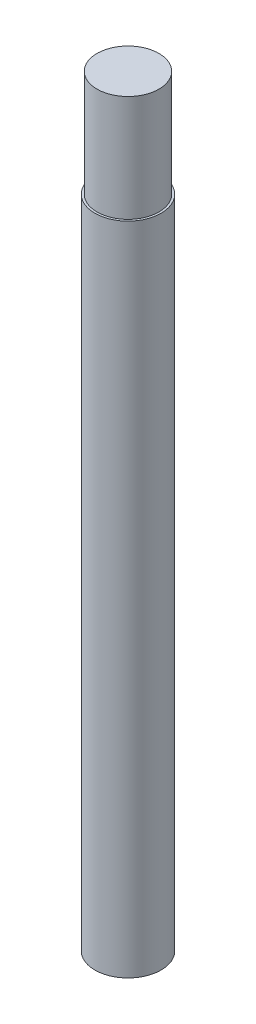
ISO-10303-21;
HEADER;
FILE_DESCRIPTION(('STEP AP214'),'2;1');
FILE_NAME('part.step','',(''),(''),'','','');
FILE_SCHEMA(('AUTOMOTIVE_DESIGN { 1 0 10303 214 1 1 1 1 }'));
ENDSEC;
DATA;
#1=APPLICATION_CONTEXT('core data for automotive mechanical design processes');
#2=APPLICATION_PROTOCOL_DEFINITION('international standard','automotive_design',2000,#1);
#3=PRODUCT_CONTEXT('',#1,'mechanical');
#4=PRODUCT('Part','Part','',(#3));
#5=PRODUCT_RELATED_PRODUCT_CATEGORY('part','',(#4));
#6=PRODUCT_DEFINITION_FORMATION('','',#4);
#7=PRODUCT_DEFINITION_CONTEXT('part definition',#1,'design');
#8=PRODUCT_DEFINITION('design','',#6,#7);
#9=PRODUCT_DEFINITION_SHAPE('','',#8);
#10=(LENGTH_UNIT() NAMED_UNIT(*) SI_UNIT(.MILLI.,.METRE.));
#11=(NAMED_UNIT(*) PLANE_ANGLE_UNIT() SI_UNIT($,.RADIAN.));
#12=(NAMED_UNIT(*) SI_UNIT($,.STERADIAN.) SOLID_ANGLE_UNIT());
#13=UNCERTAINTY_MEASURE_WITH_UNIT(LENGTH_MEASURE(1.E-05),#10,'distance_accuracy_value','');
#14=(GEOMETRIC_REPRESENTATION_CONTEXT(3) GLOBAL_UNCERTAINTY_ASSIGNED_CONTEXT((#13)) GLOBAL_UNIT_ASSIGNED_CONTEXT((#10,
#11,#12)) REPRESENTATION_CONTEXT('',''));
#15=CARTESIAN_POINT('',(0.,0.,0.));
#16=DIRECTION('',(0.,0.,1.));
#17=DIRECTION('',(1.,0.,0.));
#18=AXIS2_PLACEMENT_3D('',#15,#16,#17);
#19=CARTESIAN_POINT('',(0.,156.4386,0.));
#20=DIRECTION('',(0.,-1.,0.));
#21=DIRECTION('',(0.,0.,-1.));
#22=AXIS2_PLACEMENT_3D('',#19,#20,#21);
#23=CYLINDRICAL_SURFACE('',#22,7.89305);
#24=CARTESIAN_POINT('',(0.,156.4386,0.));
#25=DIRECTION('',(0.,1.,0.));
#26=DIRECTION('',(0.,0.,1.));
#27=AXIS2_PLACEMENT_3D('',#24,#25,#26);
#28=CIRCLE('',#27,7.89305);
#29=CARTESIAN_POINT('',(0.,156.4386,7.89305));
#30=VERTEX_POINT('',#29);
#31=EDGE_CURVE('E10',#30,#30,#28,.T.);
#32=ORIENTED_EDGE('',*,*,#31,.F.);
#33=EDGE_LOOP('',(#32));
#34=FACE_BOUND('',#33,.T.);
#35=CARTESIAN_POINT('',(0.,0.,0.));
#36=DIRECTION('',(0.,1.,0.));
#37=DIRECTION('',(0.,0.,1.));
#38=AXIS2_PLACEMENT_3D('',#35,#36,#37);
#39=CIRCLE('',#38,7.89305);
#40=CARTESIAN_POINT('',(0.,0.,7.89305));
#41=VERTEX_POINT('',#40);
#42=EDGE_CURVE('E44',#41,#41,#39,.T.);
#43=ORIENTED_EDGE('',*,*,#42,.T.);
#44=EDGE_LOOP('',(#43));
#45=FACE_BOUND('',#44,.T.);
#46=ADVANCED_FACE('F41',(#34,#45),#23,.T.);
#47=CARTESIAN_POINT('',(0.,156.4386,0.));
#48=DIRECTION('',(0.,1.,0.));
#49=DIRECTION('',(0.,0.,1.));
#50=AXIS2_PLACEMENT_3D('',#47,#48,#49);
#51=PLANE('',#50);
#52=CARTESIAN_POINT('',(0.,156.4386,0.));
#53=DIRECTION('',(0.,1.,0.));
#54=DIRECTION('',(0.,0.,1.));
#55=AXIS2_PLACEMENT_3D('',#52,#53,#54);
#56=CIRCLE('',#55,7.38505);
#57=CARTESIAN_POINT('',(0.,156.4386,7.38505));
#58=VERTEX_POINT('',#57);
#59=EDGE_CURVE('E56',#58,#58,#56,.T.);
#60=ORIENTED_EDGE('',*,*,#59,.F.);
#61=EDGE_LOOP('',(#60));
#62=FACE_BOUND('',#61,.T.);
#63=ORIENTED_EDGE('',*,*,#31,.T.);
#64=EDGE_LOOP('',(#63));
#65=FACE_BOUND('',#64,.T.);
#66=ADVANCED_FACE('F72',(#62,#65),#51,.T.);
#67=CARTESIAN_POINT('',(0.,0.,0.));
#68=DIRECTION('',(0.,1.,0.));
#69=DIRECTION('',(0.,0.,1.));
#70=AXIS2_PLACEMENT_3D('',#67,#68,#69);
#71=PLANE('',#70);
#72=ORIENTED_EDGE('',*,*,#42,.F.);
#73=EDGE_LOOP('',(#72));
#74=FACE_BOUND('',#73,.T.);
#75=ADVANCED_FACE('F68',(#74),#71,.F.);
#76=CARTESIAN_POINT('',(0.,181.8386,0.));
#77=DIRECTION('',(0.,-1.,0.));
#78=DIRECTION('',(0.,0.,-1.));
#79=AXIS2_PLACEMENT_3D('',#76,#77,#78);
#80=CYLINDRICAL_SURFACE('',#79,7.38505);
#81=CARTESIAN_POINT('',(0.,181.8386,0.));
#82=DIRECTION('',(0.,1.,0.));
#83=DIRECTION('',(0.,0.,1.));
#84=AXIS2_PLACEMENT_3D('',#81,#82,#83);
#85=CIRCLE('',#84,7.38505);
#86=CARTESIAN_POINT('',(0.,181.8386,7.38505));
#87=VERTEX_POINT('',#86);
#88=EDGE_CURVE('E54',#87,#87,#85,.T.);
#89=ORIENTED_EDGE('',*,*,#88,.F.);
#90=EDGE_LOOP('',(#89));
#91=FACE_BOUND('',#90,.T.);
#92=ORIENTED_EDGE('',*,*,#59,.T.);
#93=EDGE_LOOP('',(#92));
#94=FACE_BOUND('',#93,.T.);
#95=ADVANCED_FACE('F65',(#91,#94),#80,.T.);
#96=CARTESIAN_POINT('',(0.,181.8386,0.));
#97=DIRECTION('',(0.,1.,0.));
#98=DIRECTION('',(0.,0.,1.));
#99=AXIS2_PLACEMENT_3D('',#96,#97,#98);
#100=PLANE('',#99);
#101=ORIENTED_EDGE('',*,*,#88,.T.);
#102=EDGE_LOOP('',(#101));
#103=FACE_BOUND('',#102,.T.);
#104=ADVANCED_FACE('F63',(#103),#100,.T.);
#105=CLOSED_SHELL('',(#46,#66,#75,#95,#104));
#106=MANIFOLD_SOLID_BREP('B2',#105);
#107=ADVANCED_BREP_SHAPE_REPRESENTATION('',(#18,#106),#14);
#108=SHAPE_DEFINITION_REPRESENTATION(#9,#107);
ENDSEC;
END-ISO-10303-21;
